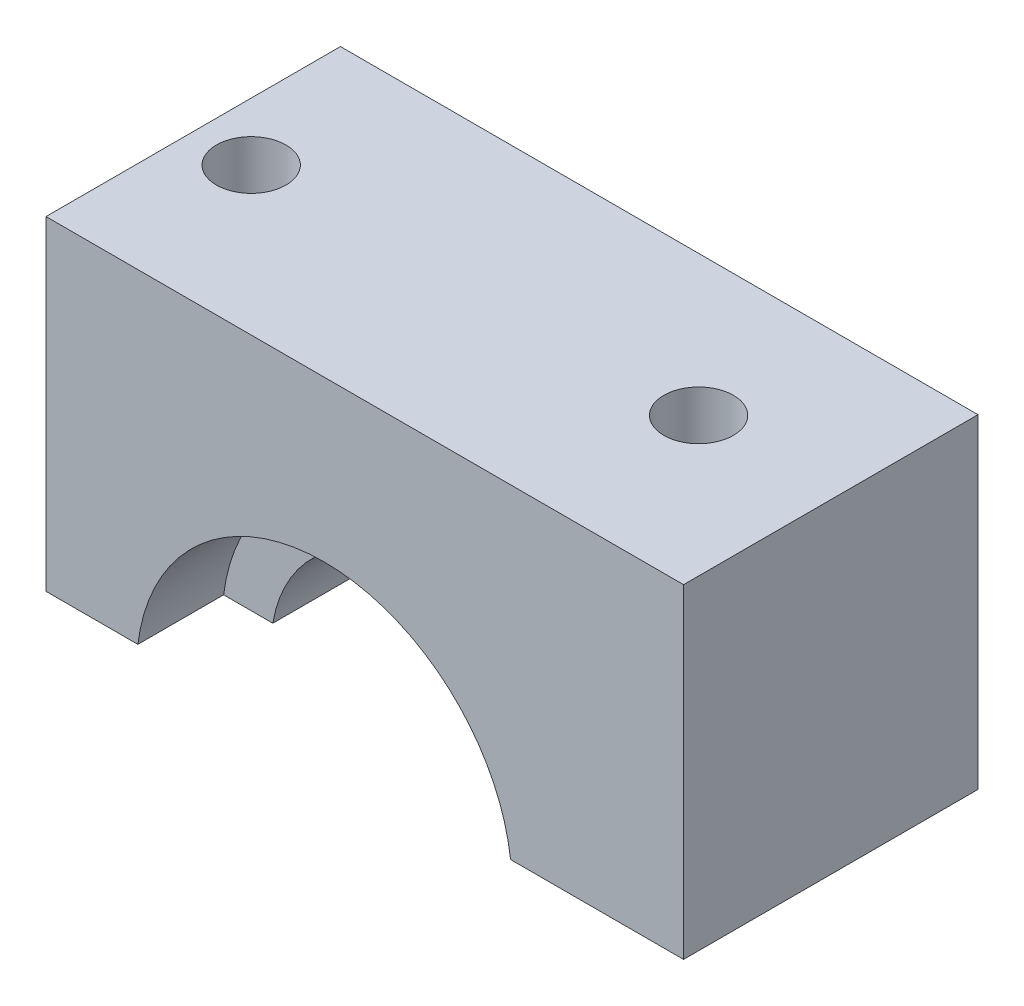
ISO-10303-21;
HEADER;
FILE_DESCRIPTION(('STEP AP214'),'2;1');
FILE_NAME('part.step','',(''),(''),'','','');
FILE_SCHEMA(('AUTOMOTIVE_DESIGN { 1 0 10303 214 1 1 1 1 }'));
ENDSEC;
DATA;
#1=APPLICATION_CONTEXT('core data for automotive mechanical design processes');
#2=APPLICATION_PROTOCOL_DEFINITION('international standard','automotive_design',2000,#1);
#3=PRODUCT_CONTEXT('',#1,'mechanical');
#4=PRODUCT('Part','Part','',(#3));
#5=PRODUCT_RELATED_PRODUCT_CATEGORY('part','',(#4));
#6=PRODUCT_DEFINITION_FORMATION('','',#4);
#7=PRODUCT_DEFINITION_CONTEXT('part definition',#1,'design');
#8=PRODUCT_DEFINITION('design','',#6,#7);
#9=PRODUCT_DEFINITION_SHAPE('','',#8);
#10=(LENGTH_UNIT() NAMED_UNIT(*) SI_UNIT(.MILLI.,.METRE.));
#11=(NAMED_UNIT(*) PLANE_ANGLE_UNIT() SI_UNIT($,.RADIAN.));
#12=(NAMED_UNIT(*) SI_UNIT($,.STERADIAN.) SOLID_ANGLE_UNIT());
#13=UNCERTAINTY_MEASURE_WITH_UNIT(LENGTH_MEASURE(1.E-05),#10,'distance_accuracy_value','');
#14=(GEOMETRIC_REPRESENTATION_CONTEXT(3) GLOBAL_UNCERTAINTY_ASSIGNED_CONTEXT((#13)) GLOBAL_UNIT_ASSIGNED_CONTEXT((#10,
#11,#12)) REPRESENTATION_CONTEXT('',''));
#15=CARTESIAN_POINT('',(0.,0.,0.));
#16=DIRECTION('',(0.,0.,1.));
#17=DIRECTION('',(1.,0.,0.));
#18=AXIS2_PLACEMENT_3D('',#15,#16,#17);
#19=CARTESIAN_POINT('',(-12.,0.,-15.));
#20=DIRECTION('',(0.,0.,1.));
#21=DIRECTION('',(1.,0.,0.));
#22=AXIS2_PLACEMENT_3D('',#19,#20,#21);
#23=CYLINDRICAL_SURFACE('',#22,6.);
#24=CARTESIAN_POINT('',(-12.,0.,-3.7));
#25=DIRECTION('',(0.,0.,1.));
#26=DIRECTION('',(1.,0.,0.));
#27=AXIS2_PLACEMENT_3D('',#24,#25,#26);
#28=CIRCLE('',#27,6.);
#29=CARTESIAN_POINT('',(-17.9160797830996,1.,-3.7));
#30=VERTEX_POINT('',#29);
#31=CARTESIAN_POINT('',(-6.08392021690038,1.,-3.7));
#32=VERTEX_POINT('',#31);
#33=EDGE_CURVE('E196',#30,#32,#28,.F.);
#34=ORIENTED_EDGE('',*,*,#33,.F.);
#35=DIRECTION('',(0.,0.,1.));
#36=VECTOR('',#35,1.);
#37=CARTESIAN_POINT('',(-17.9160797830996,1.,-15.));
#38=LINE('',#37,#36);
#39=CARTESIAN_POINT('',(-17.9160797830996,1.,-9.3));
#40=VERTEX_POINT('',#39);
#41=EDGE_CURVE('E169',#30,#40,#38,.F.);
#42=ORIENTED_EDGE('',*,*,#41,.T.);
#43=CARTESIAN_POINT('',(-12.,0.,-9.3));
#44=DIRECTION('',(0.,0.,-1.));
#45=DIRECTION('',(-1.,0.,0.));
#46=AXIS2_PLACEMENT_3D('',#43,#44,#45);
#47=CIRCLE('',#46,6.);
#48=CARTESIAN_POINT('',(-6.08392021690038,1.,-9.3));
#49=VERTEX_POINT('',#48);
#50=EDGE_CURVE('E179',#49,#40,#47,.F.);
#51=ORIENTED_EDGE('',*,*,#50,.F.);
#52=DIRECTION('',(0.,0.,1.));
#53=VECTOR('',#52,1.);
#54=CARTESIAN_POINT('',(-6.08392021690038,1.,-15.));
#55=LINE('',#54,#53);
#56=EDGE_CURVE('E48',#49,#32,#55,.T.);
#57=ORIENTED_EDGE('',*,*,#56,.T.);
#58=EDGE_LOOP('',(#34,#42,#51,#57));
#59=FACE_BOUND('',#58,.T.);
#60=ADVANCED_FACE('F33',(#59),#23,.F.);
#61=CARTESIAN_POINT('',(0.,15.,-12.7));
#62=DIRECTION('',(0.,0.,1.));
#63=DIRECTION('',(1.,0.,0.));
#64=AXIS2_PLACEMENT_3D('',#61,#62,#63);
#65=PLANE('',#64);
#66=DIRECTION('',(-1.,0.,0.));
#67=VECTOR('',#66,1.);
#68=CARTESIAN_POINT('',(0.,15.,-12.7));
#69=LINE('',#68,#67);
#70=CARTESIAN_POINT('',(3.5,15.,-12.7));
#71=VERTEX_POINT('',#70);
#72=CARTESIAN_POINT('',(-24.,15.,-12.7));
#73=VERTEX_POINT('',#72);
#74=EDGE_CURVE('E188',#71,#73,#69,.T.);
#75=ORIENTED_EDGE('',*,*,#74,.F.);
#76=DIRECTION('',(0.,1.,0.));
#77=VECTOR('',#76,1.);
#78=CARTESIAN_POINT('',(3.5,1.,-12.7));
#79=LINE('',#78,#77);
#80=CARTESIAN_POINT('',(3.5,1.,-12.7));
#81=VERTEX_POINT('',#80);
#82=EDGE_CURVE('E134',#81,#71,#79,.T.);
#83=ORIENTED_EDGE('',*,*,#82,.F.);
#84=DIRECTION('',(1.,0.,0.));
#85=VECTOR('',#84,1.);
#86=CARTESIAN_POINT('',(-24.,1.,-12.7));
#87=LINE('',#86,#85);
#88=CARTESIAN_POINT('',(-3.96196541435656,1.,-12.7));
#89=VERTEX_POINT('',#88);
#90=EDGE_CURVE('E153',#89,#81,#87,.T.);
#91=ORIENTED_EDGE('',*,*,#90,.F.);
#92=CARTESIAN_POINT('',(-12.,0.,-12.7));
#93=DIRECTION('',(0.,0.,-1.));
#94=DIRECTION('',(-1.,0.,0.));
#95=AXIS2_PLACEMENT_3D('',#92,#93,#94);
#96=CIRCLE('',#95,8.1);
#97=CARTESIAN_POINT('',(-20.0380345856434,1.,-12.7));
#98=VERTEX_POINT('',#97);
#99=EDGE_CURVE('E175',#98,#89,#96,.T.);
#100=ORIENTED_EDGE('',*,*,#99,.F.);
#101=CARTESIAN_POINT('',(-24.,1.,-12.7));
#102=VERTEX_POINT('',#101);
#103=EDGE_CURVE('E154',#102,#98,#87,.T.);
#104=ORIENTED_EDGE('',*,*,#103,.F.);
#105=DIRECTION('',(0.,-1.,0.));
#106=VECTOR('',#105,1.);
#107=CARTESIAN_POINT('',(-24.,15.,-12.7));
#108=LINE('',#107,#106);
#109=EDGE_CURVE('E194',#73,#102,#108,.T.);
#110=ORIENTED_EDGE('',*,*,#109,.F.);
#111=EDGE_LOOP('',(#75,#83,#91,#100,#104,#110));
#112=FACE_BOUND('',#111,.T.);
#113=ADVANCED_FACE('F35',(#112),#65,.F.);
#114=CARTESIAN_POINT('',(-24.,15.,0.));
#115=DIRECTION('',(1.,0.,0.));
#116=DIRECTION('',(0.,0.,-1.));
#117=AXIS2_PLACEMENT_3D('',#114,#115,#116);
#118=PLANE('',#117);
#119=ORIENTED_EDGE('',*,*,#109,.T.);
#120=DIRECTION('',(0.,0.,-1.));
#121=VECTOR('',#120,1.);
#122=CARTESIAN_POINT('',(-24.,1.,-12.7));
#123=LINE('',#122,#121);
#124=CARTESIAN_POINT('',(-24.,1.,0.));
#125=VERTEX_POINT('',#124);
#126=EDGE_CURVE('E151',#125,#102,#123,.T.);
#127=ORIENTED_EDGE('',*,*,#126,.F.);
#128=DIRECTION('',(0.,-1.,0.));
#129=VECTOR('',#128,1.);
#130=CARTESIAN_POINT('',(-24.,15.,0.));
#131=LINE('',#130,#129);
#132=CARTESIAN_POINT('',(-24.,15.,0.));
#133=VERTEX_POINT('',#132);
#134=EDGE_CURVE('E119',#133,#125,#131,.T.);
#135=ORIENTED_EDGE('',*,*,#134,.F.);
#136=DIRECTION('',(0.,0.,1.));
#137=VECTOR('',#136,1.);
#138=CARTESIAN_POINT('',(-24.,15.,0.));
#139=LINE('',#138,#137);
#140=EDGE_CURVE('E115',#73,#133,#139,.T.);
#141=ORIENTED_EDGE('',*,*,#140,.F.);
#142=EDGE_LOOP('',(#119,#127,#135,#141));
#143=FACE_BOUND('',#142,.T.);
#144=ADVANCED_FACE('F219',(#143),#118,.F.);
#145=CARTESIAN_POINT('',(0.,15.,0.));
#146=DIRECTION('',(0.,0.,-1.));
#147=DIRECTION('',(-1.,0.,0.));
#148=AXIS2_PLACEMENT_3D('',#145,#146,#147);
#149=PLANE('',#148);
#150=ORIENTED_EDGE('',*,*,#134,.T.);
#151=DIRECTION('',(-1.,0.,0.));
#152=VECTOR('',#151,1.);
#153=CARTESIAN_POINT('',(-24.,1.,0.));
#154=LINE('',#153,#152);
#155=CARTESIAN_POINT('',(-20.0380345856434,1.,0.));
#156=VERTEX_POINT('',#155);
#157=EDGE_CURVE('E156',#156,#125,#154,.T.);
#158=ORIENTED_EDGE('',*,*,#157,.F.);
#159=CARTESIAN_POINT('',(-12.,0.,0.));
#160=DIRECTION('',(0.,0.,1.));
#161=DIRECTION('',(1.,0.,0.));
#162=AXIS2_PLACEMENT_3D('',#159,#160,#161);
#163=CIRCLE('',#162,8.1);
#164=CARTESIAN_POINT('',(-3.96196541435657,1.,0.));
#165=VERTEX_POINT('',#164);
#166=EDGE_CURVE('E184',#165,#156,#163,.T.);
#167=ORIENTED_EDGE('',*,*,#166,.F.);
#168=CARTESIAN_POINT('',(3.5,1.,0.));
#169=VERTEX_POINT('',#168);
#170=EDGE_CURVE('E125',#169,#165,#154,.T.);
#171=ORIENTED_EDGE('',*,*,#170,.F.);
#172=DIRECTION('',(0.,-1.,0.));
#173=VECTOR('',#172,1.);
#174=CARTESIAN_POINT('',(3.5,15.,0.));
#175=LINE('',#174,#173);
#176=CARTESIAN_POINT('',(3.5,15.,0.));
#177=VERTEX_POINT('',#176);
#178=EDGE_CURVE('E122',#177,#169,#175,.T.);
#179=ORIENTED_EDGE('',*,*,#178,.F.);
#180=DIRECTION('',(1.,0.,0.));
#181=VECTOR('',#180,1.);
#182=CARTESIAN_POINT('',(0.,15.,0.));
#183=LINE('',#182,#181);
#184=EDGE_CURVE('E109',#133,#177,#183,.T.);
#185=ORIENTED_EDGE('',*,*,#184,.F.);
#186=EDGE_LOOP('',(#150,#158,#167,#171,#179,#185));
#187=FACE_BOUND('',#186,.T.);
#188=ADVANCED_FACE('F123',(#187),#149,.F.);
#189=CARTESIAN_POINT('',(0.,15.,0.));
#190=DIRECTION('',(0.,1.,0.));
#191=DIRECTION('',(0.,0.,1.));
#192=AXIS2_PLACEMENT_3D('',#189,#190,#191);
#193=PLANE('',#192);
#194=CARTESIAN_POINT('',(-21.5,15.,-6.35000000000001));
#195=DIRECTION('',(0.,1.,0.));
#196=DIRECTION('',(0.,0.,1.));
#197=AXIS2_PLACEMENT_3D('',#194,#195,#196);
#198=CIRCLE('',#197,1.5);
#199=CARTESIAN_POINT('',(-21.5,15.,-4.85000000000001));
#200=VERTEX_POINT('',#199);
#201=EDGE_CURVE('E143',#200,#200,#198,.T.);
#202=ORIENTED_EDGE('',*,*,#201,.F.);
#203=EDGE_LOOP('',(#202));
#204=FACE_BOUND('',#203,.T.);
#205=CARTESIAN_POINT('',(-2.50000000000001,15.,-6.65000000000001));
#206=DIRECTION('',(0.,1.,0.));
#207=DIRECTION('',(0.,0.,1.));
#208=AXIS2_PLACEMENT_3D('',#205,#206,#207);
#209=CIRCLE('',#208,1.5);
#210=CARTESIAN_POINT('',(-2.50000000000001,15.,-5.15000000000001));
#211=VERTEX_POINT('',#210);
#212=EDGE_CURVE('E148',#211,#211,#209,.T.);
#213=ORIENTED_EDGE('',*,*,#212,.F.);
#214=EDGE_LOOP('',(#213));
#215=FACE_BOUND('',#214,.T.);
#216=ORIENTED_EDGE('',*,*,#184,.T.);
#217=DIRECTION('',(0.,0.,1.));
#218=VECTOR('',#217,1.);
#219=CARTESIAN_POINT('',(3.5,15.,-12.7));
#220=LINE('',#219,#218);
#221=EDGE_CURVE('E113',#71,#177,#220,.T.);
#222=ORIENTED_EDGE('',*,*,#221,.F.);
#223=ORIENTED_EDGE('',*,*,#74,.T.);
#224=ORIENTED_EDGE('',*,*,#140,.T.);
#225=EDGE_LOOP('',(#216,#222,#223,#224));
#226=FACE_BOUND('',#225,.T.);
#227=ADVANCED_FACE('F111',(#204,#215,#226),#193,.T.);
#228=CARTESIAN_POINT('',(-12.,0.,-3.7));
#229=DIRECTION('',(0.,0.,1.));
#230=DIRECTION('',(1.,0.,0.));
#231=AXIS2_PLACEMENT_3D('',#228,#229,#230);
#232=CYLINDRICAL_SURFACE('',#231,8.1);
#233=ORIENTED_EDGE('',*,*,#166,.T.);
#234=DIRECTION('',(0.,0.,1.));
#235=VECTOR('',#234,1.);
#236=CARTESIAN_POINT('',(-20.0380345856434,1.,-3.7));
#237=LINE('',#236,#235);
#238=CARTESIAN_POINT('',(-20.0380345856434,1.,-3.7));
#239=VERTEX_POINT('',#238);
#240=EDGE_CURVE('E172',#156,#239,#237,.F.);
#241=ORIENTED_EDGE('',*,*,#240,.T.);
#242=CARTESIAN_POINT('',(-12.,0.,-3.7));
#243=DIRECTION('',(0.,0.,1.));
#244=DIRECTION('',(1.,0.,0.));
#245=AXIS2_PLACEMENT_3D('',#242,#243,#244);
#246=CIRCLE('',#245,8.1);
#247=CARTESIAN_POINT('',(-3.96196541435657,1.,-3.7));
#248=VERTEX_POINT('',#247);
#249=EDGE_CURVE('E185',#248,#239,#246,.T.);
#250=ORIENTED_EDGE('',*,*,#249,.F.);
#251=DIRECTION('',(0.,0.,1.));
#252=VECTOR('',#251,1.);
#253=CARTESIAN_POINT('',(-3.96196541435657,1.,-3.7));
#254=LINE('',#253,#252);
#255=EDGE_CURVE('E164',#248,#165,#254,.T.);
#256=ORIENTED_EDGE('',*,*,#255,.T.);
#257=EDGE_LOOP('',(#233,#241,#250,#256));
#258=FACE_BOUND('',#257,.T.);
#259=ADVANCED_FACE('F223',(#258),#232,.F.);
#260=CARTESIAN_POINT('',(-12.,0.,-3.7));
#261=DIRECTION('',(0.,0.,1.));
#262=DIRECTION('',(1.,0.,0.));
#263=AXIS2_PLACEMENT_3D('',#260,#261,#262);
#264=PLANE('',#263);
#265=DIRECTION('',(-1.,0.,0.));
#266=VECTOR('',#265,1.);
#267=CARTESIAN_POINT('',(-12.,1.,-3.7));
#268=LINE('',#267,#266);
#269=EDGE_CURVE('E162',#248,#32,#268,.T.);
#270=ORIENTED_EDGE('',*,*,#269,.F.);
#271=ORIENTED_EDGE('',*,*,#249,.T.);
#272=EDGE_CURVE('E165',#30,#239,#268,.T.);
#273=ORIENTED_EDGE('',*,*,#272,.F.);
#274=ORIENTED_EDGE('',*,*,#33,.T.);
#275=EDGE_LOOP('',(#270,#271,#273,#274));
#276=FACE_BOUND('',#275,.T.);
#277=ADVANCED_FACE('F239',(#276),#264,.T.);
#278=CARTESIAN_POINT('',(-12.,0.,-9.3));
#279=DIRECTION('',(0.,0.,-1.));
#280=DIRECTION('',(-1.,0.,0.));
#281=AXIS2_PLACEMENT_3D('',#278,#279,#280);
#282=CYLINDRICAL_SURFACE('',#281,8.1);
#283=ORIENTED_EDGE('',*,*,#99,.T.);
#284=DIRECTION('',(0.,0.,-1.));
#285=VECTOR('',#284,1.);
#286=CARTESIAN_POINT('',(-3.96196541435656,1.,-9.3));
#287=LINE('',#286,#285);
#288=CARTESIAN_POINT('',(-3.96196541435656,1.,-9.3));
#289=VERTEX_POINT('',#288);
#290=EDGE_CURVE('E158',#89,#289,#287,.F.);
#291=ORIENTED_EDGE('',*,*,#290,.T.);
#292=CARTESIAN_POINT('',(-12.,0.,-9.3));
#293=DIRECTION('',(0.,0.,-1.));
#294=DIRECTION('',(-1.,0.,0.));
#295=AXIS2_PLACEMENT_3D('',#292,#293,#294);
#296=CIRCLE('',#295,8.1);
#297=CARTESIAN_POINT('',(-20.0380345856434,1.,-9.3));
#298=VERTEX_POINT('',#297);
#299=EDGE_CURVE('E176',#298,#289,#296,.T.);
#300=ORIENTED_EDGE('',*,*,#299,.F.);
#301=DIRECTION('',(0.,0.,-1.));
#302=VECTOR('',#301,1.);
#303=CARTESIAN_POINT('',(-20.0380345856434,1.,-9.3));
#304=LINE('',#303,#302);
#305=EDGE_CURVE('E55',#298,#98,#304,.T.);
#306=ORIENTED_EDGE('',*,*,#305,.T.);
#307=EDGE_LOOP('',(#283,#291,#300,#306));
#308=FACE_BOUND('',#307,.T.);
#309=ADVANCED_FACE('F208',(#308),#282,.F.);
#310=CARTESIAN_POINT('',(-12.,0.,-9.3));
#311=DIRECTION('',(0.,0.,-1.));
#312=DIRECTION('',(-1.,0.,0.));
#313=AXIS2_PLACEMENT_3D('',#310,#311,#312);
#314=PLANE('',#313);
#315=DIRECTION('',(1.,0.,0.));
#316=VECTOR('',#315,1.);
#317=CARTESIAN_POINT('',(-12.,1.,-9.3));
#318=LINE('',#317,#316);
#319=EDGE_CURVE('E11',#298,#40,#318,.T.);
#320=ORIENTED_EDGE('',*,*,#319,.F.);
#321=ORIENTED_EDGE('',*,*,#299,.T.);
#322=EDGE_CURVE('E37',#49,#289,#318,.T.);
#323=ORIENTED_EDGE('',*,*,#322,.F.);
#324=ORIENTED_EDGE('',*,*,#50,.T.);
#325=EDGE_LOOP('',(#320,#321,#323,#324));
#326=FACE_BOUND('',#325,.T.);
#327=ADVANCED_FACE('F210',(#326),#314,.T.);
#328=CARTESIAN_POINT('',(0.,1.,0.));
#329=DIRECTION('',(0.,1.,0.));
#330=DIRECTION('',(0.,0.,1.));
#331=AXIS2_PLACEMENT_3D('',#328,#329,#330);
#332=PLANE('',#331);
#333=CARTESIAN_POINT('',(-2.50000000000001,1.,-6.65000000000001));
#334=DIRECTION('',(0.,-1.,0.));
#335=DIRECTION('',(0.,0.,-1.));
#336=AXIS2_PLACEMENT_3D('',#333,#334,#335);
#337=CIRCLE('',#336,1.5);
#338=CARTESIAN_POINT('',(-2.50000000000001,1.,-8.15000000000001));
#339=VERTEX_POINT('',#338);
#340=EDGE_CURVE('E139',#339,#339,#337,.T.);
#341=ORIENTED_EDGE('',*,*,#340,.F.);
#342=EDGE_LOOP('',(#341));
#343=FACE_BOUND('',#342,.T.);
#344=ORIENTED_EDGE('',*,*,#269,.T.);
#345=ORIENTED_EDGE('',*,*,#56,.F.);
#346=ORIENTED_EDGE('',*,*,#322,.T.);
#347=ORIENTED_EDGE('',*,*,#290,.F.);
#348=ORIENTED_EDGE('',*,*,#90,.T.);
#349=DIRECTION('',(0.,0.,-1.));
#350=VECTOR('',#349,1.);
#351=CARTESIAN_POINT('',(3.5,1.,0.));
#352=LINE('',#351,#350);
#353=EDGE_CURVE('E129',#169,#81,#352,.T.);
#354=ORIENTED_EDGE('',*,*,#353,.F.);
#355=ORIENTED_EDGE('',*,*,#170,.T.);
#356=ORIENTED_EDGE('',*,*,#255,.F.);
#357=EDGE_LOOP('',(#344,#345,#346,#347,#348,#354,#355,#356));
#358=FACE_BOUND('',#357,.T.);
#359=ADVANCED_FACE('F202',(#343,#358),#332,.F.);
#360=CARTESIAN_POINT('',(-21.5,1.,-6.35000000000001));
#361=DIRECTION('',(0.,-1.,0.));
#362=DIRECTION('',(0.,0.,-1.));
#363=AXIS2_PLACEMENT_3D('',#360,#361,#362);
#364=CIRCLE('',#363,1.5);
#365=CARTESIAN_POINT('',(-21.5,1.,-7.85000000000001));
#366=VERTEX_POINT('',#365);
#367=EDGE_CURVE('E140',#366,#366,#364,.T.);
#368=ORIENTED_EDGE('',*,*,#367,.F.);
#369=EDGE_LOOP('',(#368));
#370=FACE_BOUND('',#369,.T.);
#371=ORIENTED_EDGE('',*,*,#157,.T.);
#372=ORIENTED_EDGE('',*,*,#126,.T.);
#373=ORIENTED_EDGE('',*,*,#103,.T.);
#374=ORIENTED_EDGE('',*,*,#305,.F.);
#375=ORIENTED_EDGE('',*,*,#319,.T.);
#376=ORIENTED_EDGE('',*,*,#41,.F.);
#377=ORIENTED_EDGE('',*,*,#272,.T.);
#378=ORIENTED_EDGE('',*,*,#240,.F.);
#379=EDGE_LOOP('',(#371,#372,#373,#374,#375,#376,#377,#378));
#380=FACE_BOUND('',#379,.T.);
#381=ADVANCED_FACE('F211',(#370,#380),#332,.F.);
#382=CARTESIAN_POINT('',(-21.5,23.,-6.35000000000001));
#383=DIRECTION('',(0.,-1.,0.));
#384=DIRECTION('',(0.,0.,-1.));
#385=AXIS2_PLACEMENT_3D('',#382,#383,#384);
#386=CYLINDRICAL_SURFACE('',#385,1.5);
#387=ORIENTED_EDGE('',*,*,#201,.T.);
#388=EDGE_LOOP('',(#387));
#389=FACE_BOUND('',#388,.T.);
#390=ORIENTED_EDGE('',*,*,#367,.T.);
#391=EDGE_LOOP('',(#390));
#392=FACE_BOUND('',#391,.T.);
#393=ADVANCED_FACE('F250',(#389,#392),#386,.F.);
#394=CARTESIAN_POINT('',(-2.50000000000001,23.,-6.65000000000001));
#395=DIRECTION('',(0.,-1.,0.));
#396=DIRECTION('',(0.,0.,-1.));
#397=AXIS2_PLACEMENT_3D('',#394,#395,#396);
#398=CYLINDRICAL_SURFACE('',#397,1.5);
#399=ORIENTED_EDGE('',*,*,#212,.T.);
#400=EDGE_LOOP('',(#399));
#401=FACE_BOUND('',#400,.T.);
#402=ORIENTED_EDGE('',*,*,#340,.T.);
#403=EDGE_LOOP('',(#402));
#404=FACE_BOUND('',#403,.T.);
#405=ADVANCED_FACE('F252',(#401,#404),#398,.F.);
#406=CARTESIAN_POINT('',(3.5,0.,0.));
#407=DIRECTION('',(1.,0.,0.));
#408=DIRECTION('',(0.,0.,-1.));
#409=AXIS2_PLACEMENT_3D('',#406,#407,#408);
#410=PLANE('',#409);
#411=ORIENTED_EDGE('',*,*,#221,.T.);
#412=ORIENTED_EDGE('',*,*,#178,.T.);
#413=ORIENTED_EDGE('',*,*,#353,.T.);
#414=ORIENTED_EDGE('',*,*,#82,.T.);
#415=EDGE_LOOP('',(#411,#412,#413,#414));
#416=FACE_BOUND('',#415,.T.);
#417=ADVANCED_FACE('F132',(#416),#410,.T.);
#418=CLOSED_SHELL('',(#60,#113,#144,#188,#227,#259,#277,#309,#327,#359,#381,#393,#405,#417));
#419=MANIFOLD_SOLID_BREP('B2',#418);
#420=ADVANCED_BREP_SHAPE_REPRESENTATION('',(#18,#419),#14);
#421=SHAPE_DEFINITION_REPRESENTATION(#9,#420);
ENDSEC;
END-ISO-10303-21;
